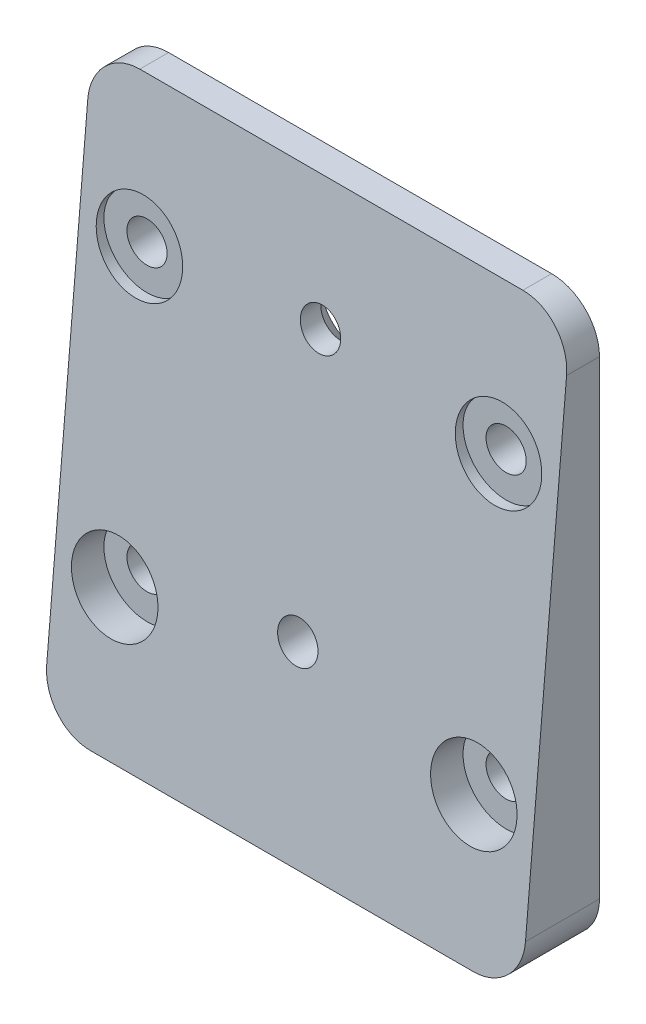
ISO-10303-21;
HEADER;
FILE_DESCRIPTION(('STEP AP214'),'2;1');
FILE_NAME('part.step','',(''),(''),'','','');
FILE_SCHEMA(('AUTOMOTIVE_DESIGN { 1 0 10303 214 1 1 1 1 }'));
ENDSEC;
DATA;
#1=APPLICATION_CONTEXT('core data for automotive mechanical design processes');
#2=APPLICATION_PROTOCOL_DEFINITION('international standard','automotive_design',2000,#1);
#3=PRODUCT_CONTEXT('',#1,'mechanical');
#4=PRODUCT('Part','Part','',(#3));
#5=PRODUCT_RELATED_PRODUCT_CATEGORY('part','',(#4));
#6=PRODUCT_DEFINITION_FORMATION('','',#4);
#7=PRODUCT_DEFINITION_CONTEXT('part definition',#1,'design');
#8=PRODUCT_DEFINITION('design','',#6,#7);
#9=PRODUCT_DEFINITION_SHAPE('','',#8);
#10=(LENGTH_UNIT() NAMED_UNIT(*) SI_UNIT(.MILLI.,.METRE.));
#11=(NAMED_UNIT(*) PLANE_ANGLE_UNIT() SI_UNIT($,.RADIAN.));
#12=(NAMED_UNIT(*) SI_UNIT($,.STERADIAN.) SOLID_ANGLE_UNIT());
#13=UNCERTAINTY_MEASURE_WITH_UNIT(LENGTH_MEASURE(1.E-05),#10,'distance_accuracy_value','');
#14=(GEOMETRIC_REPRESENTATION_CONTEXT(3) GLOBAL_UNCERTAINTY_ASSIGNED_CONTEXT((#13)) GLOBAL_UNIT_ASSIGNED_CONTEXT((#10,
#11,#12)) REPRESENTATION_CONTEXT('',''));
#15=CARTESIAN_POINT('',(0.,0.,0.));
#16=DIRECTION('',(0.,0.,1.));
#17=DIRECTION('',(1.,0.,0.));
#18=AXIS2_PLACEMENT_3D('',#15,#16,#17);
#19=CARTESIAN_POINT('',(18.75,57.0860055142034,3.));
#20=DIRECTION('',(0.,0.,-1.));
#21=DIRECTION('',(-1.,0.,0.));
#22=AXIS2_PLACEMENT_3D('',#19,#20,#21);
#23=CYLINDRICAL_SURFACE('',#22,2.1);
#24=CARTESIAN_POINT('',(18.75,57.0860055142034,0.));
#25=DIRECTION('',(0.,0.,1.));
#26=DIRECTION('',(1.,0.,0.));
#27=AXIS2_PLACEMENT_3D('',#24,#25,#26);
#28=CIRCLE('',#27,2.1);
#29=CARTESIAN_POINT('',(20.85,57.0860055142034,0.));
#30=VERTEX_POINT('',#29);
#31=EDGE_CURVE('E137',#30,#30,#28,.T.);
#32=ORIENTED_EDGE('',*,*,#31,.F.);
#33=EDGE_LOOP('',(#32));
#34=FACE_BOUND('',#33,.T.);
#35=CARTESIAN_POINT('',(18.75,57.0860055142034,3.5));
#36=DIRECTION('',(0.,0.,1.));
#37=DIRECTION('',(1.,0.,0.));
#38=AXIS2_PLACEMENT_3D('',#35,#36,#37);
#39=CIRCLE('',#38,2.1);
#40=CARTESIAN_POINT('',(20.85,57.0860055142034,3.5));
#41=VERTEX_POINT('',#40);
#42=EDGE_CURVE('E41',#41,#41,#39,.T.);
#43=ORIENTED_EDGE('',*,*,#42,.T.);
#44=EDGE_LOOP('',(#43));
#45=FACE_BOUND('',#44,.T.);
#46=ADVANCED_FACE('F37',(#34,#45),#23,.F.);
#47=CARTESIAN_POINT('',(18.75,27.5632384467491,3.));
#48=DIRECTION('',(0.,0.,-1.));
#49=DIRECTION('',(-1.,0.,0.));
#50=AXIS2_PLACEMENT_3D('',#47,#48,#49);
#51=CYLINDRICAL_SURFACE('',#50,2.1);
#52=CARTESIAN_POINT('',(18.75,27.5632384467491,0.));
#53=DIRECTION('',(0.,0.,1.));
#54=DIRECTION('',(1.,0.,0.));
#55=AXIS2_PLACEMENT_3D('',#52,#53,#54);
#56=CIRCLE('',#55,2.1);
#57=CARTESIAN_POINT('',(20.85,27.5632384467491,0.));
#58=VERTEX_POINT('',#57);
#59=EDGE_CURVE('E242',#58,#58,#56,.T.);
#60=ORIENTED_EDGE('',*,*,#59,.F.);
#61=EDGE_LOOP('',(#60));
#62=FACE_BOUND('',#61,.T.);
#63=CARTESIAN_POINT('',(18.75,27.5632384467491,3.5));
#64=DIRECTION('',(0.,0.,1.));
#65=DIRECTION('',(1.,0.,0.));
#66=AXIS2_PLACEMENT_3D('',#63,#64,#65);
#67=CIRCLE('',#66,2.1);
#68=CARTESIAN_POINT('',(20.85,27.5632384467491,3.5));
#69=VERTEX_POINT('',#68);
#70=EDGE_CURVE('E190',#69,#69,#67,.T.);
#71=ORIENTED_EDGE('',*,*,#70,.T.);
#72=EDGE_LOOP('',(#71));
#73=FACE_BOUND('',#72,.T.);
#74=ADVANCED_FACE('F273',(#62,#73),#51,.F.);
#75=CARTESIAN_POINT('',(-18.75,27.5632384467491,3.));
#76=DIRECTION('',(0.,0.,-1.));
#77=DIRECTION('',(-1.,0.,0.));
#78=AXIS2_PLACEMENT_3D('',#75,#76,#77);
#79=CYLINDRICAL_SURFACE('',#78,2.1);
#80=CARTESIAN_POINT('',(-18.75,27.5632384467491,0.));
#81=DIRECTION('',(0.,0.,1.));
#82=DIRECTION('',(-1.,0.,0.));
#83=AXIS2_PLACEMENT_3D('',#80,#81,#82);
#84=CIRCLE('',#83,2.1);
#85=CARTESIAN_POINT('',(-20.85,27.5632384467491,0.));
#86=VERTEX_POINT('',#85);
#87=EDGE_CURVE('E239',#86,#86,#84,.T.);
#88=ORIENTED_EDGE('',*,*,#87,.F.);
#89=EDGE_LOOP('',(#88));
#90=FACE_BOUND('',#89,.T.);
#91=CARTESIAN_POINT('',(-18.75,27.5632384467491,3.5));
#92=DIRECTION('',(0.,0.,1.));
#93=DIRECTION('',(1.,0.,0.));
#94=AXIS2_PLACEMENT_3D('',#91,#92,#93);
#95=CIRCLE('',#94,2.1);
#96=CARTESIAN_POINT('',(-16.65,27.5632384467491,3.5));
#97=VERTEX_POINT('',#96);
#98=EDGE_CURVE('E187',#97,#97,#95,.T.);
#99=ORIENTED_EDGE('',*,*,#98,.T.);
#100=EDGE_LOOP('',(#99));
#101=FACE_BOUND('',#100,.T.);
#102=ADVANCED_FACE('F279',(#90,#101),#79,.F.);
#103=CARTESIAN_POINT('',(-18.75,57.0860055142034,3.));
#104=DIRECTION('',(0.,0.,-1.));
#105=DIRECTION('',(-1.,0.,0.));
#106=AXIS2_PLACEMENT_3D('',#103,#104,#105);
#107=CYLINDRICAL_SURFACE('',#106,2.1);
#108=CARTESIAN_POINT('',(-18.75,57.0860055142034,0.));
#109=DIRECTION('',(0.,0.,1.));
#110=DIRECTION('',(-1.,0.,0.));
#111=AXIS2_PLACEMENT_3D('',#108,#109,#110);
#112=CIRCLE('',#111,2.1);
#113=CARTESIAN_POINT('',(-20.85,57.0860055142034,0.));
#114=VERTEX_POINT('',#113);
#115=EDGE_CURVE('E236',#114,#114,#112,.T.);
#116=ORIENTED_EDGE('',*,*,#115,.F.);
#117=EDGE_LOOP('',(#116));
#118=FACE_BOUND('',#117,.T.);
#119=CARTESIAN_POINT('',(-18.75,57.0860055142034,3.5));
#120=DIRECTION('',(0.,0.,1.));
#121=DIRECTION('',(1.,0.,0.));
#122=AXIS2_PLACEMENT_3D('',#119,#120,#121);
#123=CIRCLE('',#122,2.1);
#124=CARTESIAN_POINT('',(-16.65,57.0860055142034,3.5));
#125=VERTEX_POINT('',#124);
#126=EDGE_CURVE('E184',#125,#125,#123,.T.);
#127=ORIENTED_EDGE('',*,*,#126,.T.);
#128=EDGE_LOOP('',(#127));
#129=FACE_BOUND('',#128,.T.);
#130=ADVANCED_FACE('F296',(#118,#129),#107,.F.);
#131=CARTESIAN_POINT('',(0.,0.,0.));
#132=DIRECTION('',(0.,0.,1.));
#133=DIRECTION('',(1.,0.,0.));
#134=AXIS2_PLACEMENT_3D('',#131,#132,#133);
#135=PLANE('',#134);
#136=CARTESIAN_POINT('',(0.,31.8036255102108,0.));
#137=DIRECTION('',(0.,0.,1.));
#138=DIRECTION('',(1.,0.,0.));
#139=AXIS2_PLACEMENT_3D('',#136,#137,#138);
#140=CIRCLE('',#139,4.09999999999999);
#141=CARTESIAN_POINT('',(4.09999999999999,31.8036255102108,0.));
#142=VERTEX_POINT('',#141);
#143=EDGE_CURVE('E146',#142,#142,#140,.T.);
#144=ORIENTED_EDGE('',*,*,#143,.T.);
#145=EDGE_LOOP('',(#144));
#146=FACE_BOUND('',#145,.T.);
#147=CARTESIAN_POINT('',(0.,58.8947330899759,0.));
#148=DIRECTION('',(0.,0.,1.));
#149=DIRECTION('',(1.,0.,0.));
#150=AXIS2_PLACEMENT_3D('',#147,#148,#149);
#151=CIRCLE('',#150,4.09999999999999);
#152=CARTESIAN_POINT('',(4.09999999999999,58.8947330899759,0.));
#153=VERTEX_POINT('',#152);
#154=EDGE_CURVE('E143',#153,#153,#151,.T.);
#155=ORIENTED_EDGE('',*,*,#154,.T.);
#156=EDGE_LOOP('',(#155));
#157=FACE_BOUND('',#156,.T.);
#158=DIRECTION('',(1.,0.,0.));
#159=VECTOR('',#158,1.);
#160=CARTESIAN_POINT('',(25.,12.801854913022,0.));
#161=LINE('',#160,#159);
#162=CARTESIAN_POINT('',(-20.,12.801854913022,0.));
#163=VERTEX_POINT('',#162);
#164=CARTESIAN_POINT('',(20.,12.801854913022,0.));
#165=VERTEX_POINT('',#164);
#166=EDGE_CURVE('E121',#163,#165,#161,.T.);
#167=ORIENTED_EDGE('',*,*,#166,.F.);
#168=CARTESIAN_POINT('',(-20.,17.801854913022,0.));
#169=DIRECTION('',(0.,0.,1.));
#170=DIRECTION('',(1.,0.,0.));
#171=AXIS2_PLACEMENT_3D('',#168,#169,#170);
#172=CIRCLE('',#171,5.);
#173=CARTESIAN_POINT('',(-25.,17.801854913022,0.));
#174=VERTEX_POINT('',#173);
#175=EDGE_CURVE('E104',#163,#174,#172,.F.);
#176=ORIENTED_EDGE('',*,*,#175,.T.);
#177=DIRECTION('',(0.,-1.,0.));
#178=VECTOR('',#177,1.);
#179=CARTESIAN_POINT('',(-25.,71.8473890479305,0.));
#180=LINE('',#179,#178);
#181=CARTESIAN_POINT('',(-25.,66.8473890479305,0.));
#182=VERTEX_POINT('',#181);
#183=EDGE_CURVE('E132',#182,#174,#180,.T.);
#184=ORIENTED_EDGE('',*,*,#183,.F.);
#185=CARTESIAN_POINT('',(-20.,66.8473890479305,0.));
#186=DIRECTION('',(0.,0.,1.));
#187=DIRECTION('',(1.,0.,0.));
#188=AXIS2_PLACEMENT_3D('',#185,#186,#187);
#189=CIRCLE('',#188,5.);
#190=CARTESIAN_POINT('',(-20.,71.8473890479305,0.));
#191=VERTEX_POINT('',#190);
#192=EDGE_CURVE('E164',#182,#191,#189,.F.);
#193=ORIENTED_EDGE('',*,*,#192,.T.);
#194=DIRECTION('',(-1.,0.,0.));
#195=VECTOR('',#194,1.);
#196=CARTESIAN_POINT('',(0.,71.8473890479305,0.));
#197=LINE('',#196,#195);
#198=CARTESIAN_POINT('',(20.,71.8473890479305,0.));
#199=VERTEX_POINT('',#198);
#200=EDGE_CURVE('E135',#199,#191,#197,.T.);
#201=ORIENTED_EDGE('',*,*,#200,.F.);
#202=CARTESIAN_POINT('',(20.,66.8473890479305,0.));
#203=DIRECTION('',(0.,0.,1.));
#204=DIRECTION('',(1.,0.,0.));
#205=AXIS2_PLACEMENT_3D('',#202,#203,#204);
#206=CIRCLE('',#205,5.);
#207=CARTESIAN_POINT('',(25.,66.8473890479305,0.));
#208=VERTEX_POINT('',#207);
#209=EDGE_CURVE('E125',#199,#208,#206,.F.);
#210=ORIENTED_EDGE('',*,*,#209,.T.);
#211=DIRECTION('',(0.,1.,0.));
#212=VECTOR('',#211,1.);
#213=CARTESIAN_POINT('',(25.,71.8473890479305,0.));
#214=LINE('',#213,#212);
#215=CARTESIAN_POINT('',(25.,17.801854913022,0.));
#216=VERTEX_POINT('',#215);
#217=EDGE_CURVE('E131',#216,#208,#214,.T.);
#218=ORIENTED_EDGE('',*,*,#217,.F.);
#219=CARTESIAN_POINT('',(20.,17.801854913022,0.));
#220=DIRECTION('',(0.,0.,1.));
#221=DIRECTION('',(1.,0.,0.));
#222=AXIS2_PLACEMENT_3D('',#219,#220,#221);
#223=CIRCLE('',#222,5.);
#224=EDGE_CURVE('E115',#216,#165,#223,.F.);
#225=ORIENTED_EDGE('',*,*,#224,.T.);
#226=EDGE_LOOP('',(#167,#176,#184,#193,#201,#210,#218,#225));
#227=FACE_BOUND('',#226,.T.);
#228=ORIENTED_EDGE('',*,*,#31,.T.);
#229=EDGE_LOOP('',(#228));
#230=FACE_BOUND('',#229,.T.);
#231=ORIENTED_EDGE('',*,*,#59,.T.);
#232=EDGE_LOOP('',(#231));
#233=FACE_BOUND('',#232,.T.);
#234=ORIENTED_EDGE('',*,*,#87,.T.);
#235=EDGE_LOOP('',(#234));
#236=FACE_BOUND('',#235,.T.);
#237=ORIENTED_EDGE('',*,*,#115,.T.);
#238=EDGE_LOOP('',(#237));
#239=FACE_BOUND('',#238,.T.);
#240=ADVANCED_FACE('F128',(#146,#157,#227,#230,#233,#236,#239),#135,.F.);
#241=CARTESIAN_POINT('',(-25.,71.8473890479305,3.));
#242=DIRECTION('',(1.,0.,0.));
#243=DIRECTION('',(0.,1.,0.));
#244=AXIS2_PLACEMENT_3D('',#241,#242,#243);
#245=PLANE('',#244);
#246=ORIENTED_EDGE('',*,*,#183,.T.);
#247=DIRECTION('',(0.,0.,-1.));
#248=VECTOR('',#247,1.);
#249=CARTESIAN_POINT('',(-25.,17.801854913022,3.));
#250=LINE('',#249,#248);
#251=CARTESIAN_POINT('',(-25.,17.801854913022,7.72837155100748));
#252=VERTEX_POINT('',#251);
#253=EDGE_CURVE('E109',#174,#252,#250,.F.);
#254=ORIENTED_EDGE('',*,*,#253,.T.);
#255=DIRECTION('',(0.,0.996194698091746,-0.0871557427476514));
#256=VECTOR('',#255,1.);
#257=CARTESIAN_POINT('',(-25.,71.8473890479305,3.));
#258=LINE('',#257,#256);
#259=CARTESIAN_POINT('',(-25.,66.8473890479305,3.43744331762959));
#260=VERTEX_POINT('',#259);
#261=EDGE_CURVE('E233',#252,#260,#258,.T.);
#262=ORIENTED_EDGE('',*,*,#261,.T.);
#263=DIRECTION('',(0.,0.,-1.));
#264=VECTOR('',#263,1.);
#265=CARTESIAN_POINT('',(-25.,66.8473890479305,3.));
#266=LINE('',#265,#264);
#267=EDGE_CURVE('E114',#260,#182,#266,.T.);
#268=ORIENTED_EDGE('',*,*,#267,.T.);
#269=EDGE_LOOP('',(#246,#254,#262,#268));
#270=FACE_BOUND('',#269,.T.);
#271=ADVANCED_FACE('F254',(#270),#245,.F.);
#272=CARTESIAN_POINT('',(25.,12.801854913022,3.));
#273=DIRECTION('',(0.,1.,0.));
#274=DIRECTION('',(-1.,0.,0.));
#275=AXIS2_PLACEMENT_3D('',#272,#273,#274);
#276=PLANE('',#275);
#277=DIRECTION('',(1.,0.,0.));
#278=VECTOR('',#277,1.);
#279=CARTESIAN_POINT('',(-84.2710784829639,12.801854913022,8.16581486863706));
#280=LINE('',#279,#278);
#281=CARTESIAN_POINT('',(-20.,12.801854913022,8.16581486863706));
#282=VERTEX_POINT('',#281);
#283=CARTESIAN_POINT('',(20.,12.801854913022,8.16581486863706));
#284=VERTEX_POINT('',#283);
#285=EDGE_CURVE('E124',#282,#284,#280,.T.);
#286=ORIENTED_EDGE('',*,*,#285,.F.);
#287=DIRECTION('',(0.,0.,-1.));
#288=VECTOR('',#287,1.);
#289=CARTESIAN_POINT('',(-20.,12.801854913022,3.));
#290=LINE('',#289,#288);
#291=EDGE_CURVE('E108',#282,#163,#290,.T.);
#292=ORIENTED_EDGE('',*,*,#291,.T.);
#293=ORIENTED_EDGE('',*,*,#166,.T.);
#294=DIRECTION('',(0.,0.,-1.));
#295=VECTOR('',#294,1.);
#296=CARTESIAN_POINT('',(20.,12.801854913022,3.));
#297=LINE('',#296,#295);
#298=EDGE_CURVE('E126',#165,#284,#297,.F.);
#299=ORIENTED_EDGE('',*,*,#298,.T.);
#300=EDGE_LOOP('',(#286,#292,#293,#299));
#301=FACE_BOUND('',#300,.T.);
#302=ADVANCED_FACE('F120',(#301),#276,.F.);
#303=CARTESIAN_POINT('',(25.,71.8473890479305,3.));
#304=DIRECTION('',(-1.,0.,0.));
#305=DIRECTION('',(0.,-1.,0.));
#306=AXIS2_PLACEMENT_3D('',#303,#304,#305);
#307=PLANE('',#306);
#308=DIRECTION('',(0.,-0.996194698091746,0.0871557427476514));
#309=VECTOR('',#308,1.);
#310=CARTESIAN_POINT('',(25.,71.8473890479305,3.));
#311=LINE('',#310,#309);
#312=CARTESIAN_POINT('',(25.,66.8473890479305,3.43744331762959));
#313=VERTEX_POINT('',#312);
#314=CARTESIAN_POINT('',(25.,17.801854913022,7.72837155100747));
#315=VERTEX_POINT('',#314);
#316=EDGE_CURVE('E161',#313,#315,#311,.T.);
#317=ORIENTED_EDGE('',*,*,#316,.T.);
#318=DIRECTION('',(0.,0.,-1.));
#319=VECTOR('',#318,1.);
#320=CARTESIAN_POINT('',(25.,17.801854913022,3.));
#321=LINE('',#320,#319);
#322=EDGE_CURVE('E179',#315,#216,#321,.T.);
#323=ORIENTED_EDGE('',*,*,#322,.T.);
#324=ORIENTED_EDGE('',*,*,#217,.T.);
#325=DIRECTION('',(0.,0.,-1.));
#326=VECTOR('',#325,1.);
#327=CARTESIAN_POINT('',(25.,66.8473890479305,3.));
#328=LINE('',#327,#326);
#329=EDGE_CURVE('E177',#208,#313,#328,.F.);
#330=ORIENTED_EDGE('',*,*,#329,.T.);
#331=EDGE_LOOP('',(#317,#323,#324,#330));
#332=FACE_BOUND('',#331,.T.);
#333=ADVANCED_FACE('F260',(#332),#307,.F.);
#334=CARTESIAN_POINT('',(0.,71.8473890479305,3.));
#335=DIRECTION('',(0.,-1.,0.));
#336=DIRECTION('',(0.,0.,-1.));
#337=AXIS2_PLACEMENT_3D('',#334,#335,#336);
#338=PLANE('',#337);
#339=ORIENTED_EDGE('',*,*,#200,.T.);
#340=DIRECTION('',(0.,0.,-1.));
#341=VECTOR('',#340,1.);
#342=CARTESIAN_POINT('',(-20.,71.8473890479305,3.));
#343=LINE('',#342,#341);
#344=CARTESIAN_POINT('',(-20.,71.8473890479305,3.));
#345=VERTEX_POINT('',#344);
#346=EDGE_CURVE('E12',#191,#345,#343,.F.);
#347=ORIENTED_EDGE('',*,*,#346,.T.);
#348=DIRECTION('',(-1.,0.,0.));
#349=VECTOR('',#348,1.);
#350=CARTESIAN_POINT('',(0.,71.8473890479305,3.));
#351=LINE('',#350,#349);
#352=CARTESIAN_POINT('',(20.,71.8473890479305,3.));
#353=VERTEX_POINT('',#352);
#354=EDGE_CURVE('E142',#353,#345,#351,.T.);
#355=ORIENTED_EDGE('',*,*,#354,.F.);
#356=DIRECTION('',(0.,0.,-1.));
#357=VECTOR('',#356,1.);
#358=CARTESIAN_POINT('',(20.,71.8473890479305,3.));
#359=LINE('',#358,#357);
#360=EDGE_CURVE('E46',#353,#199,#359,.T.);
#361=ORIENTED_EDGE('',*,*,#360,.T.);
#362=EDGE_LOOP('',(#339,#347,#355,#361));
#363=FACE_BOUND('',#362,.T.);
#364=ADVANCED_FACE('F256',(#363),#338,.F.);
#365=CARTESIAN_POINT('',(0.,58.8947330899759,3.));
#366=DIRECTION('',(0.,0.,-1.));
#367=DIRECTION('',(-1.,0.,0.));
#368=AXIS2_PLACEMENT_3D('',#365,#366,#367);
#369=CYLINDRICAL_SURFACE('',#368,2.1);
#370=CARTESIAN_POINT('',(0.,58.8947330899759,2.));
#371=DIRECTION('',(0.,0.,1.));
#372=DIRECTION('',(1.,0.,0.));
#373=AXIS2_PLACEMENT_3D('',#370,#371,#372);
#374=CIRCLE('',#373,2.1);
#375=CARTESIAN_POINT('',(2.1,58.8947330899759,2.));
#376=VERTEX_POINT('',#375);
#377=EDGE_CURVE('E152',#376,#376,#374,.F.);
#378=ORIENTED_EDGE('',*,*,#377,.T.);
#379=EDGE_LOOP('',(#378));
#380=FACE_BOUND('',#379,.T.);
#381=CARTESIAN_POINT('',(0.,58.8947330899759,4.13321055887245));
#382=DIRECTION('',(0.,0.0871557427476514,0.996194698091746));
#383=DIRECTION('',(0.,0.996194698091746,-0.0871557427476514));
#384=AXIS2_PLACEMENT_3D('',#381,#382,#383);
#385=ELLIPSE('',#384,2.10802165884103,2.1);
#386=CARTESIAN_POINT('',(0.,60.9947330899759,3.94948436546802));
#387=VERTEX_POINT('',#386);
#388=EDGE_CURVE('E155',#387,#387,#385,.T.);
#389=ORIENTED_EDGE('',*,*,#388,.T.);
#390=EDGE_LOOP('',(#389));
#391=FACE_BOUND('',#390,.T.);
#392=ADVANCED_FACE('F289',(#380,#391),#369,.F.);
#393=CARTESIAN_POINT('',(0.,31.8036255102108,3.));
#394=DIRECTION('',(0.,0.,-1.));
#395=DIRECTION('',(-1.,0.,0.));
#396=AXIS2_PLACEMENT_3D('',#393,#394,#395);
#397=CYLINDRICAL_SURFACE('',#396,2.1);
#398=CARTESIAN_POINT('',(0.,31.8036255102108,2.));
#399=DIRECTION('',(0.,0.,1.));
#400=DIRECTION('',(1.,0.,0.));
#401=AXIS2_PLACEMENT_3D('',#398,#399,#400);
#402=CIRCLE('',#401,2.1);
#403=CARTESIAN_POINT('',(2.1,31.8036255102108,2.));
#404=VERTEX_POINT('',#403);
#405=EDGE_CURVE('E149',#404,#404,#402,.F.);
#406=ORIENTED_EDGE('',*,*,#405,.T.);
#407=EDGE_LOOP('',(#406));
#408=FACE_BOUND('',#407,.T.);
#409=CARTESIAN_POINT('',(0.,31.8036255102108,6.50337535446295));
#410=DIRECTION('',(0.,0.0871557427476514,0.996194698091746));
#411=DIRECTION('',(0.,0.996194698091746,-0.0871557427476514));
#412=AXIS2_PLACEMENT_3D('',#409,#410,#411);
#413=ELLIPSE('',#412,2.10802165884103,2.1);
#414=CARTESIAN_POINT('',(0.,33.9036255102108,6.31964916105852));
#415=VERTEX_POINT('',#414);
#416=EDGE_CURVE('E158',#415,#415,#413,.T.);
#417=ORIENTED_EDGE('',*,*,#416,.T.);
#418=EDGE_LOOP('',(#417));
#419=FACE_BOUND('',#418,.T.);
#420=ADVANCED_FACE('F285',(#408,#419),#397,.F.);
#421=CARTESIAN_POINT('',(0.,31.8036255102108,0.));
#422=DIRECTION('',(0.,0.,-1.));
#423=DIRECTION('',(-1.,0.,0.));
#424=AXIS2_PLACEMENT_3D('',#421,#422,#423);
#425=CONICAL_SURFACE('',#424,4.09999999999999,0.785398163397447);
#426=ORIENTED_EDGE('',*,*,#405,.F.);
#427=EDGE_LOOP('',(#426));
#428=FACE_BOUND('',#427,.T.);
#429=ORIENTED_EDGE('',*,*,#143,.F.);
#430=EDGE_LOOP('',(#429));
#431=FACE_BOUND('',#430,.T.);
#432=ADVANCED_FACE('F288',(#428,#431),#425,.F.);
#433=CARTESIAN_POINT('',(0.,58.8947330899759,0.));
#434=DIRECTION('',(0.,0.,-1.));
#435=DIRECTION('',(-1.,0.,0.));
#436=AXIS2_PLACEMENT_3D('',#433,#434,#435);
#437=CONICAL_SURFACE('',#436,4.09999999999999,0.785398163397447);
#438=ORIENTED_EDGE('',*,*,#377,.F.);
#439=EDGE_LOOP('',(#438));
#440=FACE_BOUND('',#439,.T.);
#441=ORIENTED_EDGE('',*,*,#154,.F.);
#442=EDGE_LOOP('',(#441));
#443=FACE_BOUND('',#442,.T.);
#444=ADVANCED_FACE('F308',(#440,#443),#437,.F.);
#445=CARTESIAN_POINT('',(-84.2710784829639,71.8473890479305,3.));
#446=DIRECTION('',(0.,0.0871557427476514,0.996194698091746));
#447=DIRECTION('',(0.,-0.996194698091746,0.0871557427476514));
#448=AXIS2_PLACEMENT_3D('',#445,#446,#447);
#449=PLANE('',#448);
#450=CARTESIAN_POINT('',(-18.75,27.5632384467491,6.8743611514778));
#451=DIRECTION('',(0.,0.0871557427476514,0.996194698091746));
#452=DIRECTION('',(0.,-0.996194698091746,0.0871557427476514));
#453=AXIS2_PLACEMENT_3D('',#450,#451,#452);
#454=CIRCLE('',#453,4.5);
#455=CARTESIAN_POINT('',(-18.75,23.0803623053363,7.26656199384223));
#456=VERTEX_POINT('',#455);
#457=EDGE_CURVE('E223',#456,#456,#454,.T.);
#458=ORIENTED_EDGE('',*,*,#457,.F.);
#459=EDGE_LOOP('',(#458));
#460=FACE_BOUND('',#459,.T.);
#461=CARTESIAN_POINT('',(18.75,27.5632384467491,6.8743611514778));
#462=DIRECTION('',(0.,0.0871557427476514,0.996194698091746));
#463=DIRECTION('',(0.,-0.996194698091746,0.0871557427476514));
#464=AXIS2_PLACEMENT_3D('',#461,#462,#463);
#465=CIRCLE('',#464,4.5);
#466=CARTESIAN_POINT('',(18.75,23.0803623053363,7.26656199384223));
#467=VERTEX_POINT('',#466);
#468=EDGE_CURVE('E217',#467,#467,#465,.T.);
#469=ORIENTED_EDGE('',*,*,#468,.F.);
#470=EDGE_LOOP('',(#469));
#471=FACE_BOUND('',#470,.T.);
#472=CARTESIAN_POINT('',(18.75,57.0860055142034,4.29145371715927));
#473=DIRECTION('',(0.,0.0871557427476514,0.996194698091746));
#474=DIRECTION('',(0.,-0.996194698091746,0.0871557427476514));
#475=AXIS2_PLACEMENT_3D('',#472,#473,#474);
#476=CIRCLE('',#475,4.5);
#477=CARTESIAN_POINT('',(18.75,52.6031293727905,4.6836545595237));
#478=VERTEX_POINT('',#477);
#479=EDGE_CURVE('E209',#478,#478,#476,.T.);
#480=ORIENTED_EDGE('',*,*,#479,.F.);
#481=EDGE_LOOP('',(#480));
#482=FACE_BOUND('',#481,.T.);
#483=CARTESIAN_POINT('',(-18.75,57.0860055142034,4.29145371715927));
#484=DIRECTION('',(0.,0.0871557427476514,0.996194698091746));
#485=DIRECTION('',(0.,-0.996194698091746,0.0871557427476514));
#486=AXIS2_PLACEMENT_3D('',#483,#484,#485);
#487=CIRCLE('',#486,4.5);
#488=CARTESIAN_POINT('',(-18.75,52.6031293727905,4.6836545595237));
#489=VERTEX_POINT('',#488);
#490=EDGE_CURVE('E208',#489,#489,#487,.T.);
#491=ORIENTED_EDGE('',*,*,#490,.F.);
#492=EDGE_LOOP('',(#491));
#493=FACE_BOUND('',#492,.T.);
#494=ORIENTED_EDGE('',*,*,#416,.F.);
#495=EDGE_LOOP('',(#494));
#496=FACE_BOUND('',#495,.T.);
#497=ORIENTED_EDGE('',*,*,#388,.F.);
#498=EDGE_LOOP('',(#497));
#499=FACE_BOUND('',#498,.T.);
#500=ORIENTED_EDGE('',*,*,#261,.F.);
#501=CARTESIAN_POINT('',(-20.,17.801854913022,7.72837155100747));
#502=DIRECTION('',(0.,0.0871557427476514,0.996194698091746));
#503=DIRECTION('',(0.,0.996194698091746,-0.0871557427476514));
#504=AXIS2_PLACEMENT_3D('',#501,#502,#503);
#505=ELLIPSE('',#504,5.01909918771673,5.);
#506=EDGE_CURVE('E175',#252,#282,#505,.T.);
#507=ORIENTED_EDGE('',*,*,#506,.T.);
#508=ORIENTED_EDGE('',*,*,#285,.T.);
#509=CARTESIAN_POINT('',(20.,17.801854913022,7.72837155100747));
#510=DIRECTION('',(0.,0.0871557427476514,0.996194698091746));
#511=DIRECTION('',(0.,0.996194698091746,-0.0871557427476514));
#512=AXIS2_PLACEMENT_3D('',#509,#510,#511);
#513=ELLIPSE('',#512,5.01909918771673,5.);
#514=EDGE_CURVE('E173',#284,#315,#513,.T.);
#515=ORIENTED_EDGE('',*,*,#514,.T.);
#516=ORIENTED_EDGE('',*,*,#316,.F.);
#517=CARTESIAN_POINT('',(20.,66.8473890479305,3.43744331762959));
#518=DIRECTION('',(0.,0.0871557427476514,0.996194698091746));
#519=DIRECTION('',(0.,0.996194698091746,-0.0871557427476514));
#520=AXIS2_PLACEMENT_3D('',#517,#518,#519);
#521=ELLIPSE('',#520,5.01909918771673,5.);
#522=EDGE_CURVE('E59',#313,#353,#521,.T.);
#523=ORIENTED_EDGE('',*,*,#522,.T.);
#524=ORIENTED_EDGE('',*,*,#354,.T.);
#525=CARTESIAN_POINT('',(-20.,66.8473890479305,3.43744331762959));
#526=DIRECTION('',(0.,0.0871557427476514,0.996194698091746));
#527=DIRECTION('',(0.,0.996194698091746,-0.0871557427476514));
#528=AXIS2_PLACEMENT_3D('',#525,#526,#527);
#529=ELLIPSE('',#528,5.01909918771673,5.);
#530=EDGE_CURVE('E171',#345,#260,#529,.T.);
#531=ORIENTED_EDGE('',*,*,#530,.T.);
#532=EDGE_LOOP('',(#500,#507,#508,#515,#516,#523,#524,#531));
#533=FACE_BOUND('',#532,.T.);
#534=ADVANCED_FACE('F248',(#460,#471,#482,#493,#496,#499,#533),#449,.T.);
#535=CARTESIAN_POINT('',(-20.,17.801854913022,3.));
#536=DIRECTION('',(0.,0.,-1.));
#537=DIRECTION('',(-1.,0.,0.));
#538=AXIS2_PLACEMENT_3D('',#535,#536,#537);
#539=CYLINDRICAL_SURFACE('',#538,5.);
#540=ORIENTED_EDGE('',*,*,#506,.F.);
#541=ORIENTED_EDGE('',*,*,#253,.F.);
#542=ORIENTED_EDGE('',*,*,#175,.F.);
#543=ORIENTED_EDGE('',*,*,#291,.F.);
#544=EDGE_LOOP('',(#540,#541,#542,#543));
#545=FACE_BOUND('',#544,.T.);
#546=ADVANCED_FACE('F107',(#545),#539,.T.);
#547=CARTESIAN_POINT('',(20.,17.801854913022,3.));
#548=DIRECTION('',(0.,0.,-1.));
#549=DIRECTION('',(-1.,0.,0.));
#550=AXIS2_PLACEMENT_3D('',#547,#548,#549);
#551=CYLINDRICAL_SURFACE('',#550,5.);
#552=ORIENTED_EDGE('',*,*,#514,.F.);
#553=ORIENTED_EDGE('',*,*,#298,.F.);
#554=ORIENTED_EDGE('',*,*,#224,.F.);
#555=ORIENTED_EDGE('',*,*,#322,.F.);
#556=EDGE_LOOP('',(#552,#553,#554,#555));
#557=FACE_BOUND('',#556,.T.);
#558=ADVANCED_FACE('F264',(#557),#551,.T.);
#559=CARTESIAN_POINT('',(-20.,66.8473890479305,3.));
#560=DIRECTION('',(0.,0.,-1.));
#561=DIRECTION('',(-1.,0.,0.));
#562=AXIS2_PLACEMENT_3D('',#559,#560,#561);
#563=CYLINDRICAL_SURFACE('',#562,5.);
#564=ORIENTED_EDGE('',*,*,#530,.F.);
#565=ORIENTED_EDGE('',*,*,#346,.F.);
#566=ORIENTED_EDGE('',*,*,#192,.F.);
#567=ORIENTED_EDGE('',*,*,#267,.F.);
#568=EDGE_LOOP('',(#564,#565,#566,#567));
#569=FACE_BOUND('',#568,.T.);
#570=ADVANCED_FACE('F252',(#569),#563,.T.);
#571=CARTESIAN_POINT('',(20.,66.8473890479305,3.));
#572=DIRECTION('',(0.,0.,-1.));
#573=DIRECTION('',(-1.,0.,0.));
#574=AXIS2_PLACEMENT_3D('',#571,#572,#573);
#575=CYLINDRICAL_SURFACE('',#574,5.);
#576=ORIENTED_EDGE('',*,*,#522,.F.);
#577=ORIENTED_EDGE('',*,*,#329,.F.);
#578=ORIENTED_EDGE('',*,*,#209,.F.);
#579=ORIENTED_EDGE('',*,*,#360,.F.);
#580=EDGE_LOOP('',(#576,#577,#578,#579));
#581=FACE_BOUND('',#580,.T.);
#582=ADVANCED_FACE('F39',(#581),#575,.T.);
#583=CARTESIAN_POINT('',(-18.75,55.374311871439,-15.2732941459434));
#584=DIRECTION('',(0.,0.0871557427476514,0.996194698091746));
#585=DIRECTION('',(0.,-0.996194698091746,0.0871557427476514));
#586=AXIS2_PLACEMENT_3D('',#583,#584,#585);
#587=CYLINDRICAL_SURFACE('',#586,4.5);
#588=CARTESIAN_POINT('',(-18.75,57.0167622862465,3.5));
#589=DIRECTION('',(0.,0.,1.));
#590=DIRECTION('',(0.,1.,0.));
#591=AXIS2_PLACEMENT_3D('',#588,#589,#590);
#592=ELLIPSE('',#591,4.51718926894506,4.5);
#593=CARTESIAN_POINT('',(-18.75,61.5339515551915,3.5));
#594=VERTEX_POINT('',#593);
#595=EDGE_CURVE('E188',#594,#594,#592,.F.);
#596=ORIENTED_EDGE('',*,*,#595,.T.);
#597=EDGE_LOOP('',(#596));
#598=FACE_BOUND('',#597,.T.);
#599=ORIENTED_EDGE('',*,*,#490,.T.);
#600=EDGE_LOOP('',(#599));
#601=FACE_BOUND('',#600,.T.);
#602=ADVANCED_FACE('F330',(#598,#601),#587,.F.);
#603=CARTESIAN_POINT('',(0.,0.,3.5));
#604=DIRECTION('',(0.,0.,1.));
#605=DIRECTION('',(1.,0.,0.));
#606=AXIS2_PLACEMENT_3D('',#603,#604,#605);
#607=PLANE('',#606);
#608=ORIENTED_EDGE('',*,*,#126,.F.);
#609=EDGE_LOOP('',(#608));
#610=FACE_BOUND('',#609,.T.);
#611=ORIENTED_EDGE('',*,*,#595,.F.);
#612=EDGE_LOOP('',(#611));
#613=FACE_BOUND('',#612,.T.);
#614=ADVANCED_FACE('F359',(#610,#613),#607,.T.);
#615=CARTESIAN_POINT('',(18.75,55.374311871439,-15.2732941459434));
#616=DIRECTION('',(0.,0.0871557427476514,0.996194698091746));
#617=DIRECTION('',(0.,-0.996194698091746,0.0871557427476514));
#618=AXIS2_PLACEMENT_3D('',#615,#616,#617);
#619=CYLINDRICAL_SURFACE('',#618,4.5);
#620=CARTESIAN_POINT('',(18.75,57.0167622862465,3.5));
#621=DIRECTION('',(0.,0.,1.));
#622=DIRECTION('',(0.,1.,0.));
#623=AXIS2_PLACEMENT_3D('',#620,#621,#622);
#624=ELLIPSE('',#623,4.51718926894506,4.5);
#625=CARTESIAN_POINT('',(18.75,61.5339515551915,3.5));
#626=VERTEX_POINT('',#625);
#627=EDGE_CURVE('E206',#626,#626,#624,.F.);
#628=ORIENTED_EDGE('',*,*,#627,.T.);
#629=EDGE_LOOP('',(#628));
#630=FACE_BOUND('',#629,.T.);
#631=ORIENTED_EDGE('',*,*,#479,.T.);
#632=EDGE_LOOP('',(#631));
#633=FACE_BOUND('',#632,.T.);
#634=ADVANCED_FACE('F202',(#630,#633),#619,.F.);
#635=CARTESIAN_POINT('',(0.,0.,3.5));
#636=DIRECTION('',(0.,0.,1.));
#637=DIRECTION('',(1.,0.,0.));
#638=AXIS2_PLACEMENT_3D('',#635,#636,#637);
#639=PLANE('',#638);
#640=ORIENTED_EDGE('',*,*,#42,.F.);
#641=EDGE_LOOP('',(#640));
#642=FACE_BOUND('',#641,.T.);
#643=ORIENTED_EDGE('',*,*,#627,.F.);
#644=EDGE_LOOP('',(#643));
#645=FACE_BOUND('',#644,.T.);
#646=ADVANCED_FACE('F198',(#642,#645),#639,.T.);
#647=CARTESIAN_POINT('',(18.75,25.8515448039847,-12.6903867116249));
#648=DIRECTION('',(0.,0.0871557427476514,0.996194698091746));
#649=DIRECTION('',(0.,-0.996194698091746,0.0871557427476514));
#650=AXIS2_PLACEMENT_3D('',#647,#648,#649);
#651=CYLINDRICAL_SURFACE('',#650,4.5);
#652=CARTESIAN_POINT('',(18.75,27.2680200993526,3.5));
#653=DIRECTION('',(0.,0.,1.));
#654=DIRECTION('',(0.,1.,0.));
#655=AXIS2_PLACEMENT_3D('',#652,#653,#654);
#656=ELLIPSE('',#655,4.51718926894506,4.5);
#657=CARTESIAN_POINT('',(18.75,31.7852093682976,3.5));
#658=VERTEX_POINT('',#657);
#659=EDGE_CURVE('E214',#658,#658,#656,.F.);
#660=ORIENTED_EDGE('',*,*,#659,.T.);
#661=EDGE_LOOP('',(#660));
#662=FACE_BOUND('',#661,.T.);
#663=ORIENTED_EDGE('',*,*,#468,.T.);
#664=EDGE_LOOP('',(#663));
#665=FACE_BOUND('',#664,.T.);
#666=ADVANCED_FACE('F201',(#662,#665),#651,.F.);
#667=CARTESIAN_POINT('',(0.,0.,3.5));
#668=DIRECTION('',(0.,0.,1.));
#669=DIRECTION('',(1.,0.,0.));
#670=AXIS2_PLACEMENT_3D('',#667,#668,#669);
#671=PLANE('',#670);
#672=ORIENTED_EDGE('',*,*,#70,.F.);
#673=EDGE_LOOP('',(#672));
#674=FACE_BOUND('',#673,.T.);
#675=ORIENTED_EDGE('',*,*,#659,.F.);
#676=EDGE_LOOP('',(#675));
#677=FACE_BOUND('',#676,.T.);
#678=ADVANCED_FACE('F351',(#674,#677),#671,.T.);
#679=CARTESIAN_POINT('',(-18.75,25.8515448039847,-12.6903867116249));
#680=DIRECTION('',(0.,0.0871557427476514,0.996194698091746));
#681=DIRECTION('',(0.,-0.996194698091746,0.0871557427476514));
#682=AXIS2_PLACEMENT_3D('',#679,#680,#681);
#683=CYLINDRICAL_SURFACE('',#682,4.5);
#684=CARTESIAN_POINT('',(-18.75,27.2680200993526,3.5));
#685=DIRECTION('',(0.,0.,1.));
#686=DIRECTION('',(0.,1.,0.));
#687=AXIS2_PLACEMENT_3D('',#684,#685,#686);
#688=ELLIPSE('',#687,4.51718926894506,4.5);
#689=CARTESIAN_POINT('',(-18.75,31.7852093682976,3.5));
#690=VERTEX_POINT('',#689);
#691=EDGE_CURVE('E220',#690,#690,#688,.F.);
#692=ORIENTED_EDGE('',*,*,#691,.T.);
#693=EDGE_LOOP('',(#692));
#694=FACE_BOUND('',#693,.T.);
#695=ORIENTED_EDGE('',*,*,#457,.T.);
#696=EDGE_LOOP('',(#695));
#697=FACE_BOUND('',#696,.T.);
#698=ADVANCED_FACE('F345',(#694,#697),#683,.F.);
#699=CARTESIAN_POINT('',(0.,0.,3.5));
#700=DIRECTION('',(0.,0.,1.));
#701=DIRECTION('',(1.,0.,0.));
#702=AXIS2_PLACEMENT_3D('',#699,#700,#701);
#703=PLANE('',#702);
#704=ORIENTED_EDGE('',*,*,#98,.F.);
#705=EDGE_LOOP('',(#704));
#706=FACE_BOUND('',#705,.T.);
#707=ORIENTED_EDGE('',*,*,#691,.F.);
#708=EDGE_LOOP('',(#707));
#709=FACE_BOUND('',#708,.T.);
#710=ADVANCED_FACE('F342',(#706,#709),#703,.T.);
#711=CLOSED_SHELL('',(#46,#74,#102,#130,#240,#271,#302,#333,#364,#392,#420,#432,#444,#534,#546,
#558,#570,#582,#602,#614,#634,#646,#666,#678,#698,#710));
#712=MANIFOLD_SOLID_BREP('B2',#711);
#713=ADVANCED_BREP_SHAPE_REPRESENTATION('',(#18,#712),#14);
#714=SHAPE_DEFINITION_REPRESENTATION(#9,#713);
ENDSEC;
END-ISO-10303-21;
